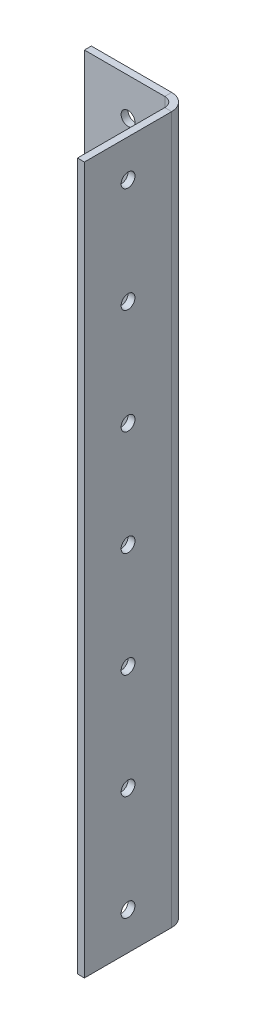
ISO-10303-21;
HEADER;
FILE_DESCRIPTION(('STEP AP214'),'2;1');
FILE_NAME('part.step','',(''),(''),'','','');
FILE_SCHEMA(('AUTOMOTIVE_DESIGN { 1 0 10303 214 1 1 1 1 }'));
ENDSEC;
DATA;
#1=APPLICATION_CONTEXT('core data for automotive mechanical design processes');
#2=APPLICATION_PROTOCOL_DEFINITION('international standard','automotive_design',2000,#1);
#3=PRODUCT_CONTEXT('',#1,'mechanical');
#4=PRODUCT('Part','Part','',(#3));
#5=PRODUCT_RELATED_PRODUCT_CATEGORY('part','',(#4));
#6=PRODUCT_DEFINITION_FORMATION('','',#4);
#7=PRODUCT_DEFINITION_CONTEXT('part definition',#1,'design');
#8=PRODUCT_DEFINITION('design','',#6,#7);
#9=PRODUCT_DEFINITION_SHAPE('','',#8);
#10=(LENGTH_UNIT() NAMED_UNIT(*) SI_UNIT(.MILLI.,.METRE.));
#11=(NAMED_UNIT(*) PLANE_ANGLE_UNIT() SI_UNIT($,.RADIAN.));
#12=(NAMED_UNIT(*) SI_UNIT($,.STERADIAN.) SOLID_ANGLE_UNIT());
#13=UNCERTAINTY_MEASURE_WITH_UNIT(LENGTH_MEASURE(1.E-05),#10,'distance_accuracy_value','');
#14=(GEOMETRIC_REPRESENTATION_CONTEXT(3) GLOBAL_UNCERTAINTY_ASSIGNED_CONTEXT((#13)) GLOBAL_UNIT_ASSIGNED_CONTEXT((#10,
#11,#12)) REPRESENTATION_CONTEXT('',''));
#15=CARTESIAN_POINT('',(0.,0.,0.));
#16=DIRECTION('',(0.,0.,1.));
#17=DIRECTION('',(1.,0.,0.));
#18=AXIS2_PLACEMENT_3D('',#15,#16,#17);
#19=CARTESIAN_POINT('',(-70.,510.,-10.));
#20=DIRECTION('',(0.,1.,0.));
#21=DIRECTION('',(0.,0.,1.));
#22=AXIS2_PLACEMENT_3D('',#19,#20,#21);
#23=PLANE('',#22);
#24=DIRECTION('',(-1.,0.,0.));
#25=VECTOR('',#24,1.);
#26=CARTESIAN_POINT('',(-70.,510.,0.));
#27=LINE('',#26,#25);
#28=CARTESIAN_POINT('',(46.,510.,0.));
#29=VERTEX_POINT('',#28);
#30=CARTESIAN_POINT('',(-70.,510.,0.));
#31=VERTEX_POINT('',#30);
#32=EDGE_CURVE('E117',#29,#31,#27,.T.);
#33=ORIENTED_EDGE('',*,*,#32,.F.);
#34=DIRECTION('',(0.,0.,-1.));
#35=VECTOR('',#34,1.);
#36=CARTESIAN_POINT('',(46.,510.,0.));
#37=LINE('',#36,#35);
#38=CARTESIAN_POINT('',(46.,510.,-9.99999999999999));
#39=VERTEX_POINT('',#38);
#40=EDGE_CURVE('E130',#29,#39,#37,.T.);
#41=ORIENTED_EDGE('',*,*,#40,.T.);
#42=DIRECTION('',(-1.,0.,0.));
#43=VECTOR('',#42,1.);
#44=CARTESIAN_POINT('',(-70.,510.,-10.));
#45=LINE('',#44,#43);
#46=CARTESIAN_POINT('',(-70.,510.,-10.));
#47=VERTEX_POINT('',#46);
#48=EDGE_CURVE('E122',#39,#47,#45,.T.);
#49=ORIENTED_EDGE('',*,*,#48,.T.);
#50=DIRECTION('',(0.,0.,1.));
#51=VECTOR('',#50,1.);
#52=CARTESIAN_POINT('',(-70.,510.,-10.));
#53=LINE('',#52,#51);
#54=EDGE_CURVE('E72',#47,#31,#53,.T.);
#55=ORIENTED_EDGE('',*,*,#54,.T.);
#56=EDGE_LOOP('',(#33,#41,#49,#55));
#57=FACE_BOUND('',#56,.T.);
#58=ADVANCED_FACE('F69',(#57),#23,.T.);
#59=CARTESIAN_POINT('',(0.,0.,-10.));
#60=DIRECTION('',(0.,0.,-1.));
#61=DIRECTION('',(-1.,0.,0.));
#62=AXIS2_PLACEMENT_3D('',#59,#60,#61);
#63=PLANE('',#62);
#64=CARTESIAN_POINT('',(-7.00000000000003,304.,-10.));
#65=DIRECTION('',(0.,0.,1.));
#66=DIRECTION('',(1.,0.,0.));
#67=AXIS2_PLACEMENT_3D('',#64,#65,#66);
#68=CIRCLE('',#67,10.);
#69=CARTESIAN_POINT('',(2.99999999999998,304.,-10.));
#70=VERTEX_POINT('',#69);
#71=EDGE_CURVE('E202',#70,#70,#68,.T.);
#72=ORIENTED_EDGE('',*,*,#71,.T.);
#73=EDGE_LOOP('',(#72));
#74=FACE_BOUND('',#73,.T.);
#75=CARTESIAN_POINT('',(-7.00000000000003,152.,-10.));
#76=DIRECTION('',(0.,0.,1.));
#77=DIRECTION('',(1.,0.,0.));
#78=AXIS2_PLACEMENT_3D('',#75,#76,#77);
#79=CIRCLE('',#78,10.);
#80=CARTESIAN_POINT('',(2.99999999999998,152.,-10.));
#81=VERTEX_POINT('',#80);
#82=EDGE_CURVE('E261',#81,#81,#79,.T.);
#83=ORIENTED_EDGE('',*,*,#82,.T.);
#84=EDGE_LOOP('',(#83));
#85=FACE_BOUND('',#84,.T.);
#86=CARTESIAN_POINT('',(-7.00000000000003,0.,-10.));
#87=DIRECTION('',(0.,0.,1.));
#88=DIRECTION('',(1.,0.,0.));
#89=AXIS2_PLACEMENT_3D('',#86,#87,#88);
#90=CIRCLE('',#89,10.);
#91=CARTESIAN_POINT('',(2.99999999999998,0.,-10.));
#92=VERTEX_POINT('',#91);
#93=EDGE_CURVE('E255',#92,#92,#90,.T.);
#94=ORIENTED_EDGE('',*,*,#93,.T.);
#95=EDGE_LOOP('',(#94));
#96=FACE_BOUND('',#95,.T.);
#97=CARTESIAN_POINT('',(-7.00000000000003,-152.,-10.));
#98=DIRECTION('',(0.,0.,1.));
#99=DIRECTION('',(1.,0.,0.));
#100=AXIS2_PLACEMENT_3D('',#97,#98,#99);
#101=CIRCLE('',#100,10.);
#102=CARTESIAN_POINT('',(2.99999999999998,-152.,-10.));
#103=VERTEX_POINT('',#102);
#104=EDGE_CURVE('E249',#103,#103,#101,.T.);
#105=ORIENTED_EDGE('',*,*,#104,.T.);
#106=EDGE_LOOP('',(#105));
#107=FACE_BOUND('',#106,.T.);
#108=CARTESIAN_POINT('',(-7.00000000000003,-304.,-10.));
#109=DIRECTION('',(0.,0.,1.));
#110=DIRECTION('',(1.,0.,0.));
#111=AXIS2_PLACEMENT_3D('',#108,#109,#110);
#112=CIRCLE('',#111,10.);
#113=CARTESIAN_POINT('',(2.99999999999998,-304.,-10.));
#114=VERTEX_POINT('',#113);
#115=EDGE_CURVE('E243',#114,#114,#112,.T.);
#116=ORIENTED_EDGE('',*,*,#115,.T.);
#117=EDGE_LOOP('',(#116));
#118=FACE_BOUND('',#117,.T.);
#119=CARTESIAN_POINT('',(-7.00000000000003,-456.,-10.));
#120=DIRECTION('',(0.,0.,1.));
#121=DIRECTION('',(1.,0.,0.));
#122=AXIS2_PLACEMENT_3D('',#119,#120,#121);
#123=CIRCLE('',#122,10.);
#124=CARTESIAN_POINT('',(2.99999999999998,-456.,-10.));
#125=VERTEX_POINT('',#124);
#126=EDGE_CURVE('E237',#125,#125,#123,.T.);
#127=ORIENTED_EDGE('',*,*,#126,.T.);
#128=EDGE_LOOP('',(#127));
#129=FACE_BOUND('',#128,.T.);
#130=CARTESIAN_POINT('',(-7.00000000000003,456.,-10.));
#131=DIRECTION('',(0.,0.,1.));
#132=DIRECTION('',(1.,0.,0.));
#133=AXIS2_PLACEMENT_3D('',#130,#131,#132);
#134=CIRCLE('',#133,10.);
#135=CARTESIAN_POINT('',(2.99999999999998,456.,-10.));
#136=VERTEX_POINT('',#135);
#137=EDGE_CURVE('E189',#136,#136,#134,.T.);
#138=ORIENTED_EDGE('',*,*,#137,.T.);
#139=EDGE_LOOP('',(#138));
#140=FACE_BOUND('',#139,.T.);
#141=ORIENTED_EDGE('',*,*,#48,.F.);
#142=DIRECTION('',(0.,1.,0.));
#143=VECTOR('',#142,1.);
#144=CARTESIAN_POINT('',(46.,510.,-9.99999999999999));
#145=LINE('',#144,#143);
#146=CARTESIAN_POINT('',(46.,-510.,-10.));
#147=VERTEX_POINT('',#146);
#148=EDGE_CURVE('E147',#39,#147,#145,.F.);
#149=ORIENTED_EDGE('',*,*,#148,.T.);
#150=DIRECTION('',(1.,0.,0.));
#151=VECTOR('',#150,1.);
#152=CARTESIAN_POINT('',(-70.,-510.,-10.));
#153=LINE('',#152,#151);
#154=CARTESIAN_POINT('',(-70.,-510.,-10.));
#155=VERTEX_POINT('',#154);
#156=EDGE_CURVE('E127',#155,#147,#153,.T.);
#157=ORIENTED_EDGE('',*,*,#156,.F.);
#158=DIRECTION('',(0.,-1.,0.));
#159=VECTOR('',#158,1.);
#160=CARTESIAN_POINT('',(-70.,-510.,-10.));
#161=LINE('',#160,#159);
#162=EDGE_CURVE('E107',#47,#155,#161,.T.);
#163=ORIENTED_EDGE('',*,*,#162,.F.);
#164=EDGE_LOOP('',(#141,#149,#157,#163));
#165=FACE_BOUND('',#164,.T.);
#166=ADVANCED_FACE('F270',(#74,#85,#96,#107,#118,#129,#140,#165),#63,.T.);
#167=CARTESIAN_POINT('',(0.,0.,0.));
#168=DIRECTION('',(0.,0.,-1.));
#169=DIRECTION('',(-1.,0.,0.));
#170=AXIS2_PLACEMENT_3D('',#167,#168,#169);
#171=PLANE('',#170);
#172=CARTESIAN_POINT('',(-7.00000000000003,304.,0.));
#173=DIRECTION('',(0.,0.,1.));
#174=DIRECTION('',(1.,0.,0.));
#175=AXIS2_PLACEMENT_3D('',#172,#173,#174);
#176=CIRCLE('',#175,10.);
#177=CARTESIAN_POINT('',(2.99999999999998,304.,0.));
#178=VERTEX_POINT('',#177);
#179=EDGE_CURVE('E264',#178,#178,#176,.T.);
#180=ORIENTED_EDGE('',*,*,#179,.F.);
#181=EDGE_LOOP('',(#180));
#182=FACE_BOUND('',#181,.T.);
#183=CARTESIAN_POINT('',(-7.00000000000003,152.,0.));
#184=DIRECTION('',(0.,0.,1.));
#185=DIRECTION('',(1.,0.,0.));
#186=AXIS2_PLACEMENT_3D('',#183,#184,#185);
#187=CIRCLE('',#186,10.);
#188=CARTESIAN_POINT('',(2.99999999999998,152.,0.));
#189=VERTEX_POINT('',#188);
#190=EDGE_CURVE('E258',#189,#189,#187,.T.);
#191=ORIENTED_EDGE('',*,*,#190,.F.);
#192=EDGE_LOOP('',(#191));
#193=FACE_BOUND('',#192,.T.);
#194=CARTESIAN_POINT('',(-7.00000000000003,0.,0.));
#195=DIRECTION('',(0.,0.,1.));
#196=DIRECTION('',(1.,0.,0.));
#197=AXIS2_PLACEMENT_3D('',#194,#195,#196);
#198=CIRCLE('',#197,10.);
#199=CARTESIAN_POINT('',(2.99999999999998,0.,0.));
#200=VERTEX_POINT('',#199);
#201=EDGE_CURVE('E252',#200,#200,#198,.T.);
#202=ORIENTED_EDGE('',*,*,#201,.F.);
#203=EDGE_LOOP('',(#202));
#204=FACE_BOUND('',#203,.T.);
#205=CARTESIAN_POINT('',(-7.00000000000003,-152.,0.));
#206=DIRECTION('',(0.,0.,1.));
#207=DIRECTION('',(1.,0.,0.));
#208=AXIS2_PLACEMENT_3D('',#205,#206,#207);
#209=CIRCLE('',#208,10.);
#210=CARTESIAN_POINT('',(2.99999999999998,-152.,0.));
#211=VERTEX_POINT('',#210);
#212=EDGE_CURVE('E246',#211,#211,#209,.T.);
#213=ORIENTED_EDGE('',*,*,#212,.F.);
#214=EDGE_LOOP('',(#213));
#215=FACE_BOUND('',#214,.T.);
#216=CARTESIAN_POINT('',(-7.00000000000003,-304.,0.));
#217=DIRECTION('',(0.,0.,1.));
#218=DIRECTION('',(1.,0.,0.));
#219=AXIS2_PLACEMENT_3D('',#216,#217,#218);
#220=CIRCLE('',#219,10.);
#221=CARTESIAN_POINT('',(2.99999999999998,-304.,0.));
#222=VERTEX_POINT('',#221);
#223=EDGE_CURVE('E240',#222,#222,#220,.T.);
#224=ORIENTED_EDGE('',*,*,#223,.F.);
#225=EDGE_LOOP('',(#224));
#226=FACE_BOUND('',#225,.T.);
#227=CARTESIAN_POINT('',(-7.00000000000003,-456.,0.));
#228=DIRECTION('',(0.,0.,1.));
#229=DIRECTION('',(1.,0.,0.));
#230=AXIS2_PLACEMENT_3D('',#227,#228,#229);
#231=CIRCLE('',#230,10.);
#232=CARTESIAN_POINT('',(2.99999999999998,-456.,0.));
#233=VERTEX_POINT('',#232);
#234=EDGE_CURVE('E234',#233,#233,#231,.T.);
#235=ORIENTED_EDGE('',*,*,#234,.F.);
#236=EDGE_LOOP('',(#235));
#237=FACE_BOUND('',#236,.T.);
#238=CARTESIAN_POINT('',(-7.00000000000003,456.,0.));
#239=DIRECTION('',(0.,0.,1.));
#240=DIRECTION('',(1.,0.,0.));
#241=AXIS2_PLACEMENT_3D('',#238,#239,#240);
#242=CIRCLE('',#241,10.);
#243=CARTESIAN_POINT('',(2.99999999999998,456.,0.));
#244=VERTEX_POINT('',#243);
#245=EDGE_CURVE('E192',#244,#244,#242,.T.);
#246=ORIENTED_EDGE('',*,*,#245,.F.);
#247=EDGE_LOOP('',(#246));
#248=FACE_BOUND('',#247,.T.);
#249=DIRECTION('',(0.,1.,0.));
#250=VECTOR('',#249,1.);
#251=CARTESIAN_POINT('',(46.,510.,0.));
#252=LINE('',#251,#250);
#253=CARTESIAN_POINT('',(46.,-510.,0.));
#254=VERTEX_POINT('',#253);
#255=EDGE_CURVE('E137',#29,#254,#252,.F.);
#256=ORIENTED_EDGE('',*,*,#255,.F.);
#257=ORIENTED_EDGE('',*,*,#32,.T.);
#258=DIRECTION('',(0.,-1.,0.));
#259=VECTOR('',#258,1.);
#260=CARTESIAN_POINT('',(-70.,-510.,0.));
#261=LINE('',#260,#259);
#262=CARTESIAN_POINT('',(-70.,-510.,0.));
#263=VERTEX_POINT('',#262);
#264=EDGE_CURVE('E105',#31,#263,#261,.T.);
#265=ORIENTED_EDGE('',*,*,#264,.T.);
#266=DIRECTION('',(1.,0.,0.));
#267=VECTOR('',#266,1.);
#268=CARTESIAN_POINT('',(-70.,-510.,0.));
#269=LINE('',#268,#267);
#270=EDGE_CURVE('E114',#263,#254,#269,.T.);
#271=ORIENTED_EDGE('',*,*,#270,.T.);
#272=EDGE_LOOP('',(#256,#257,#265,#271));
#273=FACE_BOUND('',#272,.T.);
#274=ADVANCED_FACE('F112',(#182,#193,#204,#215,#226,#237,#248,#273),#171,.F.);
#275=CARTESIAN_POINT('',(-70.,-510.,-10.));
#276=DIRECTION('',(0.,-1.,0.));
#277=DIRECTION('',(0.,0.,-1.));
#278=AXIS2_PLACEMENT_3D('',#275,#276,#277);
#279=PLANE('',#278);
#280=DIRECTION('',(0.,0.,-1.));
#281=VECTOR('',#280,1.);
#282=CARTESIAN_POINT('',(46.,-510.,0.));
#283=LINE('',#282,#281);
#284=EDGE_CURVE('E121',#254,#147,#283,.T.);
#285=ORIENTED_EDGE('',*,*,#284,.F.);
#286=ORIENTED_EDGE('',*,*,#270,.F.);
#287=DIRECTION('',(0.,0.,1.));
#288=VECTOR('',#287,1.);
#289=CARTESIAN_POINT('',(-70.,-510.,-10.));
#290=LINE('',#289,#288);
#291=EDGE_CURVE('E15',#155,#263,#290,.T.);
#292=ORIENTED_EDGE('',*,*,#291,.F.);
#293=ORIENTED_EDGE('',*,*,#156,.T.);
#294=EDGE_LOOP('',(#285,#286,#292,#293));
#295=FACE_BOUND('',#294,.T.);
#296=ADVANCED_FACE('F120',(#295),#279,.T.);
#297=CARTESIAN_POINT('',(-70.,-510.,-10.));
#298=DIRECTION('',(-1.,0.,0.));
#299=DIRECTION('',(0.,0.,1.));
#300=AXIS2_PLACEMENT_3D('',#297,#298,#299);
#301=PLANE('',#300);
#302=ORIENTED_EDGE('',*,*,#264,.F.);
#303=ORIENTED_EDGE('',*,*,#54,.F.);
#304=ORIENTED_EDGE('',*,*,#162,.T.);
#305=ORIENTED_EDGE('',*,*,#291,.T.);
#306=EDGE_LOOP('',(#302,#303,#304,#305));
#307=FACE_BOUND('',#306,.T.);
#308=ADVANCED_FACE('F103',(#307),#301,.T.);
#309=CARTESIAN_POINT('',(46.,-510.,14.));
#310=DIRECTION('',(0.,-1.,0.));
#311=DIRECTION('',(0.,0.,-1.));
#312=AXIS2_PLACEMENT_3D('',#309,#310,#311);
#313=PLANE('',#312);
#314=DIRECTION('',(-1.,0.,0.));
#315=VECTOR('',#314,1.);
#316=CARTESIAN_POINT('',(70.,-510.,13.9999999999999));
#317=LINE('',#316,#315);
#318=CARTESIAN_POINT('',(60.,-510.,14.));
#319=VERTEX_POINT('',#318);
#320=CARTESIAN_POINT('',(70.,-510.,13.9999999999999));
#321=VERTEX_POINT('',#320);
#322=EDGE_CURVE('E151',#319,#321,#317,.F.);
#323=ORIENTED_EDGE('',*,*,#322,.F.);
#324=CARTESIAN_POINT('',(46.,-510.,14.));
#325=DIRECTION('',(0.,1.,0.));
#326=DIRECTION('',(0.,0.,1.));
#327=AXIS2_PLACEMENT_3D('',#324,#325,#326);
#328=CIRCLE('',#327,14.);
#329=EDGE_CURVE('E141',#254,#319,#328,.F.);
#330=ORIENTED_EDGE('',*,*,#329,.F.);
#331=ORIENTED_EDGE('',*,*,#284,.T.);
#332=CARTESIAN_POINT('',(46.,-510.,14.));
#333=DIRECTION('',(0.,1.,0.));
#334=DIRECTION('',(0.,0.,1.));
#335=AXIS2_PLACEMENT_3D('',#332,#333,#334);
#336=CIRCLE('',#335,24.);
#337=EDGE_CURVE('E83',#147,#321,#336,.F.);
#338=ORIENTED_EDGE('',*,*,#337,.T.);
#339=EDGE_LOOP('',(#323,#330,#331,#338));
#340=FACE_BOUND('',#339,.T.);
#341=ADVANCED_FACE('F370',(#340),#313,.T.);
#342=CARTESIAN_POINT('',(46.,510.,14.));
#343=DIRECTION('',(0.,-1.,0.));
#344=DIRECTION('',(0.,0.,-1.));
#345=AXIS2_PLACEMENT_3D('',#342,#343,#344);
#346=PLANE('',#345);
#347=CARTESIAN_POINT('',(46.,510.,14.));
#348=DIRECTION('',(0.,1.,0.));
#349=DIRECTION('',(0.,0.,1.));
#350=AXIS2_PLACEMENT_3D('',#347,#348,#349);
#351=CIRCLE('',#350,14.);
#352=CARTESIAN_POINT('',(60.,510.,14.));
#353=VERTEX_POINT('',#352);
#354=EDGE_CURVE('E134',#353,#29,#351,.T.);
#355=ORIENTED_EDGE('',*,*,#354,.F.);
#356=DIRECTION('',(-1.,0.,0.));
#357=VECTOR('',#356,1.);
#358=CARTESIAN_POINT('',(60.,510.,14.));
#359=LINE('',#358,#357);
#360=CARTESIAN_POINT('',(70.,510.,13.9999999999999));
#361=VERTEX_POINT('',#360);
#362=EDGE_CURVE('E158',#353,#361,#359,.F.);
#363=ORIENTED_EDGE('',*,*,#362,.T.);
#364=CARTESIAN_POINT('',(46.,510.,14.));
#365=DIRECTION('',(0.,1.,0.));
#366=DIRECTION('',(0.,0.,1.));
#367=AXIS2_PLACEMENT_3D('',#364,#365,#366);
#368=CIRCLE('',#367,24.);
#369=EDGE_CURVE('E144',#361,#39,#368,.T.);
#370=ORIENTED_EDGE('',*,*,#369,.T.);
#371=ORIENTED_EDGE('',*,*,#40,.F.);
#372=EDGE_LOOP('',(#355,#363,#370,#371));
#373=FACE_BOUND('',#372,.T.);
#374=ADVANCED_FACE('F350',(#373),#346,.F.);
#375=CARTESIAN_POINT('',(46.,510.,14.));
#376=DIRECTION('',(0.,1.,0.));
#377=DIRECTION('',(1.,0.,0.));
#378=AXIS2_PLACEMENT_3D('',#375,#376,#377);
#379=CYLINDRICAL_SURFACE('',#378,24.);
#380=ORIENTED_EDGE('',*,*,#148,.F.);
#381=ORIENTED_EDGE('',*,*,#369,.F.);
#382=DIRECTION('',(0.,1.,0.));
#383=VECTOR('',#382,1.);
#384=CARTESIAN_POINT('',(70.,-510.,13.9999999999999));
#385=LINE('',#384,#383);
#386=EDGE_CURVE('E161',#361,#321,#385,.F.);
#387=ORIENTED_EDGE('',*,*,#386,.T.);
#388=ORIENTED_EDGE('',*,*,#337,.F.);
#389=EDGE_LOOP('',(#380,#381,#387,#388));
#390=FACE_BOUND('',#389,.T.);
#391=ADVANCED_FACE('F348',(#390),#379,.T.);
#392=CARTESIAN_POINT('',(46.,510.,14.));
#393=DIRECTION('',(0.,1.,0.));
#394=DIRECTION('',(1.,0.,0.));
#395=AXIS2_PLACEMENT_3D('',#392,#393,#394);
#396=CYLINDRICAL_SURFACE('',#395,14.);
#397=ORIENTED_EDGE('',*,*,#255,.T.);
#398=ORIENTED_EDGE('',*,*,#329,.T.);
#399=DIRECTION('',(0.,1.,0.));
#400=VECTOR('',#399,1.);
#401=CARTESIAN_POINT('',(60.,-510.,14.));
#402=LINE('',#401,#400);
#403=EDGE_CURVE('E154',#319,#353,#402,.T.);
#404=ORIENTED_EDGE('',*,*,#403,.T.);
#405=ORIENTED_EDGE('',*,*,#354,.T.);
#406=EDGE_LOOP('',(#397,#398,#404,#405));
#407=FACE_BOUND('',#406,.T.);
#408=ADVANCED_FACE('F369',(#407),#396,.F.);
#409=CARTESIAN_POINT('',(70.0000000000005,510.,140.));
#410=DIRECTION('',(0.,-1.,0.));
#411=DIRECTION('',(0.,0.,-1.));
#412=AXIS2_PLACEMENT_3D('',#409,#410,#411);
#413=PLANE('',#412);
#414=ORIENTED_EDGE('',*,*,#362,.F.);
#415=DIRECTION('',(0.,0.,-1.));
#416=VECTOR('',#415,1.);
#417=CARTESIAN_POINT('',(60.0000000000005,510.,140.));
#418=LINE('',#417,#416);
#419=CARTESIAN_POINT('',(60.0000000000005,510.,140.));
#420=VERTEX_POINT('',#419);
#421=EDGE_CURVE('E163',#353,#420,#418,.F.);
#422=ORIENTED_EDGE('',*,*,#421,.T.);
#423=DIRECTION('',(-1.,0.,0.));
#424=VECTOR('',#423,1.);
#425=CARTESIAN_POINT('',(70.0000000000005,510.,140.));
#426=LINE('',#425,#424);
#427=CARTESIAN_POINT('',(70.0000000000005,510.,140.));
#428=VERTEX_POINT('',#427);
#429=EDGE_CURVE('E138',#428,#420,#426,.T.);
#430=ORIENTED_EDGE('',*,*,#429,.F.);
#431=DIRECTION('',(0.,0.,1.));
#432=VECTOR('',#431,1.);
#433=CARTESIAN_POINT('',(70.,510.,-2.77776100025184E-13));
#434=LINE('',#433,#432);
#435=EDGE_CURVE('E172',#361,#428,#434,.T.);
#436=ORIENTED_EDGE('',*,*,#435,.F.);
#437=EDGE_LOOP('',(#414,#422,#430,#436));
#438=FACE_BOUND('',#437,.T.);
#439=ADVANCED_FACE('F359',(#438),#413,.F.);
#440=CARTESIAN_POINT('',(70.,-510.,0.));
#441=DIRECTION('',(0.,1.,0.));
#442=DIRECTION('',(0.,0.,1.));
#443=AXIS2_PLACEMENT_3D('',#440,#441,#442);
#444=PLANE('',#443);
#445=ORIENTED_EDGE('',*,*,#322,.T.);
#446=DIRECTION('',(0.,0.,-1.));
#447=VECTOR('',#446,1.);
#448=CARTESIAN_POINT('',(70.,-510.,-2.77776100025184E-13));
#449=LINE('',#448,#447);
#450=CARTESIAN_POINT('',(70.0000000000005,-510.,140.));
#451=VERTEX_POINT('',#450);
#452=EDGE_CURVE('E178',#451,#321,#449,.T.);
#453=ORIENTED_EDGE('',*,*,#452,.F.);
#454=DIRECTION('',(-1.,0.,0.));
#455=VECTOR('',#454,1.);
#456=CARTESIAN_POINT('',(70.0000000000005,-510.,140.));
#457=LINE('',#456,#455);
#458=CARTESIAN_POINT('',(60.0000000000005,-510.,140.));
#459=VERTEX_POINT('',#458);
#460=EDGE_CURVE('E181',#451,#459,#457,.T.);
#461=ORIENTED_EDGE('',*,*,#460,.T.);
#462=DIRECTION('',(0.,0.,1.));
#463=VECTOR('',#462,1.);
#464=CARTESIAN_POINT('',(60.,-510.,0.));
#465=LINE('',#464,#463);
#466=EDGE_CURVE('E169',#459,#319,#465,.F.);
#467=ORIENTED_EDGE('',*,*,#466,.T.);
#468=EDGE_LOOP('',(#445,#453,#461,#467));
#469=FACE_BOUND('',#468,.T.);
#470=ADVANCED_FACE('F364',(#469),#444,.F.);
#471=CARTESIAN_POINT('',(70.,0.,-2.77776100025184E-13));
#472=DIRECTION('',(-1.,0.,0.));
#473=DIRECTION('',(0.,0.,1.));
#474=AXIS2_PLACEMENT_3D('',#471,#472,#473);
#475=PLANE('',#474);
#476=CARTESIAN_POINT('',(70.0000000000002,304.,77.));
#477=DIRECTION('',(-1.,0.,0.));
#478=DIRECTION('',(0.,0.,1.));
#479=AXIS2_PLACEMENT_3D('',#476,#477,#478);
#480=CIRCLE('',#479,10.);
#481=CARTESIAN_POINT('',(70.0000000000003,304.,87.));
#482=VERTEX_POINT('',#481);
#483=EDGE_CURVE('E195',#482,#482,#480,.T.);
#484=ORIENTED_EDGE('',*,*,#483,.T.);
#485=EDGE_LOOP('',(#484));
#486=FACE_BOUND('',#485,.T.);
#487=CARTESIAN_POINT('',(70.0000000000002,152.,77.));
#488=DIRECTION('',(-1.,0.,0.));
#489=DIRECTION('',(0.,0.,1.));
#490=AXIS2_PLACEMENT_3D('',#487,#488,#489);
#491=CIRCLE('',#490,10.);
#492=CARTESIAN_POINT('',(70.0000000000003,152.,87.));
#493=VERTEX_POINT('',#492);
#494=EDGE_CURVE('E226',#493,#493,#491,.T.);
#495=ORIENTED_EDGE('',*,*,#494,.T.);
#496=EDGE_LOOP('',(#495));
#497=FACE_BOUND('',#496,.T.);
#498=CARTESIAN_POINT('',(70.0000000000002,0.,77.));
#499=DIRECTION('',(-1.,0.,0.));
#500=DIRECTION('',(0.,0.,1.));
#501=AXIS2_PLACEMENT_3D('',#498,#499,#500);
#502=CIRCLE('',#501,10.);
#503=CARTESIAN_POINT('',(70.0000000000003,0.,87.));
#504=VERTEX_POINT('',#503);
#505=EDGE_CURVE('E220',#504,#504,#502,.T.);
#506=ORIENTED_EDGE('',*,*,#505,.T.);
#507=EDGE_LOOP('',(#506));
#508=FACE_BOUND('',#507,.T.);
#509=CARTESIAN_POINT('',(70.0000000000002,-152.,77.));
#510=DIRECTION('',(-1.,0.,0.));
#511=DIRECTION('',(0.,0.,1.));
#512=AXIS2_PLACEMENT_3D('',#509,#510,#511);
#513=CIRCLE('',#512,10.);
#514=CARTESIAN_POINT('',(70.0000000000003,-152.,87.));
#515=VERTEX_POINT('',#514);
#516=EDGE_CURVE('E214',#515,#515,#513,.T.);
#517=ORIENTED_EDGE('',*,*,#516,.T.);
#518=EDGE_LOOP('',(#517));
#519=FACE_BOUND('',#518,.T.);
#520=CARTESIAN_POINT('',(70.0000000000002,-304.,77.));
#521=DIRECTION('',(-1.,0.,0.));
#522=DIRECTION('',(0.,0.,1.));
#523=AXIS2_PLACEMENT_3D('',#520,#521,#522);
#524=CIRCLE('',#523,10.);
#525=CARTESIAN_POINT('',(70.0000000000003,-304.,87.));
#526=VERTEX_POINT('',#525);
#527=EDGE_CURVE('E208',#526,#526,#524,.T.);
#528=ORIENTED_EDGE('',*,*,#527,.T.);
#529=EDGE_LOOP('',(#528));
#530=FACE_BOUND('',#529,.T.);
#531=CARTESIAN_POINT('',(70.0000000000002,-456.,77.));
#532=DIRECTION('',(-1.,0.,0.));
#533=DIRECTION('',(0.,0.,1.));
#534=AXIS2_PLACEMENT_3D('',#531,#532,#533);
#535=CIRCLE('',#534,10.);
#536=CARTESIAN_POINT('',(70.0000000000003,-456.,87.));
#537=VERTEX_POINT('',#536);
#538=EDGE_CURVE('E201',#537,#537,#535,.T.);
#539=ORIENTED_EDGE('',*,*,#538,.T.);
#540=EDGE_LOOP('',(#539));
#541=FACE_BOUND('',#540,.T.);
#542=CARTESIAN_POINT('',(70.0000000000002,456.,77.));
#543=DIRECTION('',(-1.,0.,0.));
#544=DIRECTION('',(0.,0.,1.));
#545=AXIS2_PLACEMENT_3D('',#542,#543,#544);
#546=CIRCLE('',#545,10.);
#547=CARTESIAN_POINT('',(70.0000000000003,456.,87.));
#548=VERTEX_POINT('',#547);
#549=EDGE_CURVE('E155',#548,#548,#546,.T.);
#550=ORIENTED_EDGE('',*,*,#549,.T.);
#551=EDGE_LOOP('',(#550));
#552=FACE_BOUND('',#551,.T.);
#553=ORIENTED_EDGE('',*,*,#386,.F.);
#554=ORIENTED_EDGE('',*,*,#435,.T.);
#555=DIRECTION('',(0.,-1.,0.));
#556=VECTOR('',#555,1.);
#557=CARTESIAN_POINT('',(70.0000000000005,0.,140.));
#558=LINE('',#557,#556);
#559=EDGE_CURVE('E175',#428,#451,#558,.T.);
#560=ORIENTED_EDGE('',*,*,#559,.T.);
#561=ORIENTED_EDGE('',*,*,#452,.T.);
#562=EDGE_LOOP('',(#553,#554,#560,#561));
#563=FACE_BOUND('',#562,.T.);
#564=ADVANCED_FACE('F356',(#486,#497,#508,#519,#530,#541,#552,#563),#475,.F.);
#565=CARTESIAN_POINT('',(60.,0.,-2.42861286636753E-13));
#566=DIRECTION('',(-1.,0.,0.));
#567=DIRECTION('',(0.,0.,1.));
#568=AXIS2_PLACEMENT_3D('',#565,#566,#567);
#569=PLANE('',#568);
#570=CARTESIAN_POINT('',(60.0000000000002,304.,77.));
#571=DIRECTION('',(-1.,0.,0.));
#572=DIRECTION('',(0.,0.,1.));
#573=AXIS2_PLACEMENT_3D('',#570,#571,#572);
#574=CIRCLE('',#573,10.);
#575=CARTESIAN_POINT('',(60.0000000000003,304.,87.));
#576=VERTEX_POINT('',#575);
#577=EDGE_CURVE('E229',#576,#576,#574,.T.);
#578=ORIENTED_EDGE('',*,*,#577,.F.);
#579=EDGE_LOOP('',(#578));
#580=FACE_BOUND('',#579,.T.);
#581=CARTESIAN_POINT('',(60.0000000000002,152.,77.));
#582=DIRECTION('',(-1.,0.,0.));
#583=DIRECTION('',(0.,0.,1.));
#584=AXIS2_PLACEMENT_3D('',#581,#582,#583);
#585=CIRCLE('',#584,10.);
#586=CARTESIAN_POINT('',(60.0000000000003,152.,87.));
#587=VERTEX_POINT('',#586);
#588=EDGE_CURVE('E223',#587,#587,#585,.T.);
#589=ORIENTED_EDGE('',*,*,#588,.F.);
#590=EDGE_LOOP('',(#589));
#591=FACE_BOUND('',#590,.T.);
#592=CARTESIAN_POINT('',(60.0000000000002,0.,77.));
#593=DIRECTION('',(-1.,0.,0.));
#594=DIRECTION('',(0.,0.,1.));
#595=AXIS2_PLACEMENT_3D('',#592,#593,#594);
#596=CIRCLE('',#595,10.);
#597=CARTESIAN_POINT('',(60.0000000000003,0.,87.));
#598=VERTEX_POINT('',#597);
#599=EDGE_CURVE('E217',#598,#598,#596,.T.);
#600=ORIENTED_EDGE('',*,*,#599,.F.);
#601=EDGE_LOOP('',(#600));
#602=FACE_BOUND('',#601,.T.);
#603=CARTESIAN_POINT('',(60.0000000000002,-152.,77.));
#604=DIRECTION('',(-1.,0.,0.));
#605=DIRECTION('',(0.,0.,1.));
#606=AXIS2_PLACEMENT_3D('',#603,#604,#605);
#607=CIRCLE('',#606,10.);
#608=CARTESIAN_POINT('',(60.0000000000003,-152.,87.));
#609=VERTEX_POINT('',#608);
#610=EDGE_CURVE('E211',#609,#609,#607,.T.);
#611=ORIENTED_EDGE('',*,*,#610,.F.);
#612=EDGE_LOOP('',(#611));
#613=FACE_BOUND('',#612,.T.);
#614=CARTESIAN_POINT('',(60.0000000000002,-304.,77.));
#615=DIRECTION('',(-1.,0.,0.));
#616=DIRECTION('',(0.,0.,1.));
#617=AXIS2_PLACEMENT_3D('',#614,#615,#616);
#618=CIRCLE('',#617,10.);
#619=CARTESIAN_POINT('',(60.0000000000003,-304.,87.));
#620=VERTEX_POINT('',#619);
#621=EDGE_CURVE('E205',#620,#620,#618,.T.);
#622=ORIENTED_EDGE('',*,*,#621,.F.);
#623=EDGE_LOOP('',(#622));
#624=FACE_BOUND('',#623,.T.);
#625=CARTESIAN_POINT('',(60.0000000000002,-456.,77.));
#626=DIRECTION('',(-1.,0.,0.));
#627=DIRECTION('',(0.,0.,1.));
#628=AXIS2_PLACEMENT_3D('',#625,#626,#627);
#629=CIRCLE('',#628,10.);
#630=CARTESIAN_POINT('',(60.0000000000003,-456.,87.));
#631=VERTEX_POINT('',#630);
#632=EDGE_CURVE('E198',#631,#631,#629,.T.);
#633=ORIENTED_EDGE('',*,*,#632,.F.);
#634=EDGE_LOOP('',(#633));
#635=FACE_BOUND('',#634,.T.);
#636=CARTESIAN_POINT('',(60.0000000000002,456.,77.));
#637=DIRECTION('',(-1.,0.,0.));
#638=DIRECTION('',(0.,0.,1.));
#639=AXIS2_PLACEMENT_3D('',#636,#637,#638);
#640=CIRCLE('',#639,10.);
#641=CARTESIAN_POINT('',(60.0000000000003,456.,87.));
#642=VERTEX_POINT('',#641);
#643=EDGE_CURVE('E186',#642,#642,#640,.T.);
#644=ORIENTED_EDGE('',*,*,#643,.F.);
#645=EDGE_LOOP('',(#644));
#646=FACE_BOUND('',#645,.T.);
#647=ORIENTED_EDGE('',*,*,#421,.F.);
#648=ORIENTED_EDGE('',*,*,#403,.F.);
#649=ORIENTED_EDGE('',*,*,#466,.F.);
#650=DIRECTION('',(0.,1.,0.));
#651=VECTOR('',#650,1.);
#652=CARTESIAN_POINT('',(60.0000000000005,-510.,140.));
#653=LINE('',#652,#651);
#654=EDGE_CURVE('E166',#420,#459,#653,.F.);
#655=ORIENTED_EDGE('',*,*,#654,.F.);
#656=EDGE_LOOP('',(#647,#648,#649,#655));
#657=FACE_BOUND('',#656,.T.);
#658=ADVANCED_FACE('F367',(#580,#591,#602,#613,#624,#635,#646,#657),#569,.T.);
#659=CARTESIAN_POINT('',(70.0000000000005,-510.,140.));
#660=DIRECTION('',(0.,0.,-1.));
#661=DIRECTION('',(-1.,0.,0.));
#662=AXIS2_PLACEMENT_3D('',#659,#660,#661);
#663=PLANE('',#662);
#664=ORIENTED_EDGE('',*,*,#654,.T.);
#665=ORIENTED_EDGE('',*,*,#460,.F.);
#666=ORIENTED_EDGE('',*,*,#559,.F.);
#667=ORIENTED_EDGE('',*,*,#429,.T.);
#668=EDGE_LOOP('',(#664,#665,#666,#667));
#669=FACE_BOUND('',#668,.T.);
#670=ADVANCED_FACE('F308',(#669),#663,.F.);
#671=CARTESIAN_POINT('',(70.0000000000002,456.,77.));
#672=DIRECTION('',(-1.,0.,0.));
#673=DIRECTION('',(0.,0.,1.));
#674=AXIS2_PLACEMENT_3D('',#671,#672,#673);
#675=CYLINDRICAL_SURFACE('',#674,10.);
#676=ORIENTED_EDGE('',*,*,#549,.F.);
#677=EDGE_LOOP('',(#676));
#678=FACE_BOUND('',#677,.T.);
#679=ORIENTED_EDGE('',*,*,#643,.T.);
#680=EDGE_LOOP('',(#679));
#681=FACE_BOUND('',#680,.T.);
#682=ADVANCED_FACE('F298',(#678,#681),#675,.F.);
#683=CARTESIAN_POINT('',(-7.00000000000003,456.,-10.));
#684=DIRECTION('',(0.,0.,1.));
#685=DIRECTION('',(1.,0.,0.));
#686=AXIS2_PLACEMENT_3D('',#683,#684,#685);
#687=CYLINDRICAL_SURFACE('',#686,10.);
#688=ORIENTED_EDGE('',*,*,#137,.F.);
#689=EDGE_LOOP('',(#688));
#690=FACE_BOUND('',#689,.T.);
#691=ORIENTED_EDGE('',*,*,#245,.T.);
#692=EDGE_LOOP('',(#691));
#693=FACE_BOUND('',#692,.T.);
#694=ADVANCED_FACE('F295',(#690,#693),#687,.F.);
#695=CARTESIAN_POINT('',(70.0000000000002,-456.,77.));
#696=DIRECTION('',(-1.,0.,0.));
#697=DIRECTION('',(0.,0.,1.));
#698=AXIS2_PLACEMENT_3D('',#695,#696,#697);
#699=CYLINDRICAL_SURFACE('',#698,10.);
#700=ORIENTED_EDGE('',*,*,#538,.F.);
#701=EDGE_LOOP('',(#700));
#702=FACE_BOUND('',#701,.T.);
#703=ORIENTED_EDGE('',*,*,#632,.T.);
#704=EDGE_LOOP('',(#703));
#705=FACE_BOUND('',#704,.T.);
#706=ADVANCED_FACE('F297',(#702,#705),#699,.F.);
#707=CARTESIAN_POINT('',(70.0000000000002,-304.,77.));
#708=DIRECTION('',(-1.,0.,0.));
#709=DIRECTION('',(0.,0.,1.));
#710=AXIS2_PLACEMENT_3D('',#707,#708,#709);
#711=CYLINDRICAL_SURFACE('',#710,10.);
#712=ORIENTED_EDGE('',*,*,#527,.F.);
#713=EDGE_LOOP('',(#712));
#714=FACE_BOUND('',#713,.T.);
#715=ORIENTED_EDGE('',*,*,#621,.T.);
#716=EDGE_LOOP('',(#715));
#717=FACE_BOUND('',#716,.T.);
#718=ADVANCED_FACE('F305',(#714,#717),#711,.F.);
#719=CARTESIAN_POINT('',(70.0000000000002,-152.,77.));
#720=DIRECTION('',(-1.,0.,0.));
#721=DIRECTION('',(0.,0.,1.));
#722=AXIS2_PLACEMENT_3D('',#719,#720,#721);
#723=CYLINDRICAL_SURFACE('',#722,10.);
#724=ORIENTED_EDGE('',*,*,#516,.F.);
#725=EDGE_LOOP('',(#724));
#726=FACE_BOUND('',#725,.T.);
#727=ORIENTED_EDGE('',*,*,#610,.T.);
#728=EDGE_LOOP('',(#727));
#729=FACE_BOUND('',#728,.T.);
#730=ADVANCED_FACE('F495',(#726,#729),#723,.F.);
#731=CARTESIAN_POINT('',(70.0000000000002,0.,77.));
#732=DIRECTION('',(-1.,0.,0.));
#733=DIRECTION('',(0.,0.,1.));
#734=AXIS2_PLACEMENT_3D('',#731,#732,#733);
#735=CYLINDRICAL_SURFACE('',#734,10.);
#736=ORIENTED_EDGE('',*,*,#505,.F.);
#737=EDGE_LOOP('',(#736));
#738=FACE_BOUND('',#737,.T.);
#739=ORIENTED_EDGE('',*,*,#599,.T.);
#740=EDGE_LOOP('',(#739));
#741=FACE_BOUND('',#740,.T.);
#742=ADVANCED_FACE('F504',(#738,#741),#735,.F.);
#743=CARTESIAN_POINT('',(70.0000000000002,152.,77.));
#744=DIRECTION('',(-1.,0.,0.));
#745=DIRECTION('',(0.,0.,1.));
#746=AXIS2_PLACEMENT_3D('',#743,#744,#745);
#747=CYLINDRICAL_SURFACE('',#746,10.);
#748=ORIENTED_EDGE('',*,*,#494,.F.);
#749=EDGE_LOOP('',(#748));
#750=FACE_BOUND('',#749,.T.);
#751=ORIENTED_EDGE('',*,*,#588,.T.);
#752=EDGE_LOOP('',(#751));
#753=FACE_BOUND('',#752,.T.);
#754=ADVANCED_FACE('F513',(#750,#753),#747,.F.);
#755=CARTESIAN_POINT('',(70.0000000000002,304.,77.));
#756=DIRECTION('',(-1.,0.,0.));
#757=DIRECTION('',(0.,0.,1.));
#758=AXIS2_PLACEMENT_3D('',#755,#756,#757);
#759=CYLINDRICAL_SURFACE('',#758,10.);
#760=ORIENTED_EDGE('',*,*,#483,.F.);
#761=EDGE_LOOP('',(#760));
#762=FACE_BOUND('',#761,.T.);
#763=ORIENTED_EDGE('',*,*,#577,.T.);
#764=EDGE_LOOP('',(#763));
#765=FACE_BOUND('',#764,.T.);
#766=ADVANCED_FACE('F522',(#762,#765),#759,.F.);
#767=CARTESIAN_POINT('',(-7.00000000000003,-456.,-10.));
#768=DIRECTION('',(0.,0.,1.));
#769=DIRECTION('',(1.,0.,0.));
#770=AXIS2_PLACEMENT_3D('',#767,#768,#769);
#771=CYLINDRICAL_SURFACE('',#770,10.);
#772=ORIENTED_EDGE('',*,*,#126,.F.);
#773=EDGE_LOOP('',(#772));
#774=FACE_BOUND('',#773,.T.);
#775=ORIENTED_EDGE('',*,*,#234,.T.);
#776=EDGE_LOOP('',(#775));
#777=FACE_BOUND('',#776,.T.);
#778=ADVANCED_FACE('F531',(#774,#777),#771,.F.);
#779=CARTESIAN_POINT('',(-7.00000000000003,-304.,-10.));
#780=DIRECTION('',(0.,0.,1.));
#781=DIRECTION('',(1.,0.,0.));
#782=AXIS2_PLACEMENT_3D('',#779,#780,#781);
#783=CYLINDRICAL_SURFACE('',#782,10.);
#784=ORIENTED_EDGE('',*,*,#115,.F.);
#785=EDGE_LOOP('',(#784));
#786=FACE_BOUND('',#785,.T.);
#787=ORIENTED_EDGE('',*,*,#223,.T.);
#788=EDGE_LOOP('',(#787));
#789=FACE_BOUND('',#788,.T.);
#790=ADVANCED_FACE('F540',(#786,#789),#783,.F.);
#791=CARTESIAN_POINT('',(-7.00000000000003,-152.,-10.));
#792=DIRECTION('',(0.,0.,1.));
#793=DIRECTION('',(1.,0.,0.));
#794=AXIS2_PLACEMENT_3D('',#791,#792,#793);
#795=CYLINDRICAL_SURFACE('',#794,10.);
#796=ORIENTED_EDGE('',*,*,#104,.F.);
#797=EDGE_LOOP('',(#796));
#798=FACE_BOUND('',#797,.T.);
#799=ORIENTED_EDGE('',*,*,#212,.T.);
#800=EDGE_LOOP('',(#799));
#801=FACE_BOUND('',#800,.T.);
#802=ADVANCED_FACE('F549',(#798,#801),#795,.F.);
#803=CARTESIAN_POINT('',(-7.00000000000003,0.,-10.));
#804=DIRECTION('',(0.,0.,1.));
#805=DIRECTION('',(1.,0.,0.));
#806=AXIS2_PLACEMENT_3D('',#803,#804,#805);
#807=CYLINDRICAL_SURFACE('',#806,10.);
#808=ORIENTED_EDGE('',*,*,#93,.F.);
#809=EDGE_LOOP('',(#808));
#810=FACE_BOUND('',#809,.T.);
#811=ORIENTED_EDGE('',*,*,#201,.T.);
#812=EDGE_LOOP('',(#811));
#813=FACE_BOUND('',#812,.T.);
#814=ADVANCED_FACE('F558',(#810,#813),#807,.F.);
#815=CARTESIAN_POINT('',(-7.00000000000003,152.,-10.));
#816=DIRECTION('',(0.,0.,1.));
#817=DIRECTION('',(1.,0.,0.));
#818=AXIS2_PLACEMENT_3D('',#815,#816,#817);
#819=CYLINDRICAL_SURFACE('',#818,10.);
#820=ORIENTED_EDGE('',*,*,#82,.F.);
#821=EDGE_LOOP('',(#820));
#822=FACE_BOUND('',#821,.T.);
#823=ORIENTED_EDGE('',*,*,#190,.T.);
#824=EDGE_LOOP('',(#823));
#825=FACE_BOUND('',#824,.T.);
#826=ADVANCED_FACE('F276',(#822,#825),#819,.F.);
#827=CARTESIAN_POINT('',(-7.00000000000003,304.,-10.));
#828=DIRECTION('',(0.,0.,1.));
#829=DIRECTION('',(1.,0.,0.));
#830=AXIS2_PLACEMENT_3D('',#827,#828,#829);
#831=CYLINDRICAL_SURFACE('',#830,10.);
#832=ORIENTED_EDGE('',*,*,#71,.F.);
#833=EDGE_LOOP('',(#832));
#834=FACE_BOUND('',#833,.T.);
#835=ORIENTED_EDGE('',*,*,#179,.T.);
#836=EDGE_LOOP('',(#835));
#837=FACE_BOUND('',#836,.T.);
#838=ADVANCED_FACE('F273',(#834,#837),#831,.F.);
#839=CLOSED_SHELL('',(#58,#166,#274,#296,#308,#341,#374,#391,#408,#439,#470,#564,#658,#670,#682,
#694,#706,#718,#730,#742,#754,#766,#778,#790,#802,#814,#826,#838));
#840=MANIFOLD_SOLID_BREP('B2',#839);
#841=ADVANCED_BREP_SHAPE_REPRESENTATION('',(#18,#840),#14);
#842=SHAPE_DEFINITION_REPRESENTATION(#9,#841);
ENDSEC;
END-ISO-10303-21;
